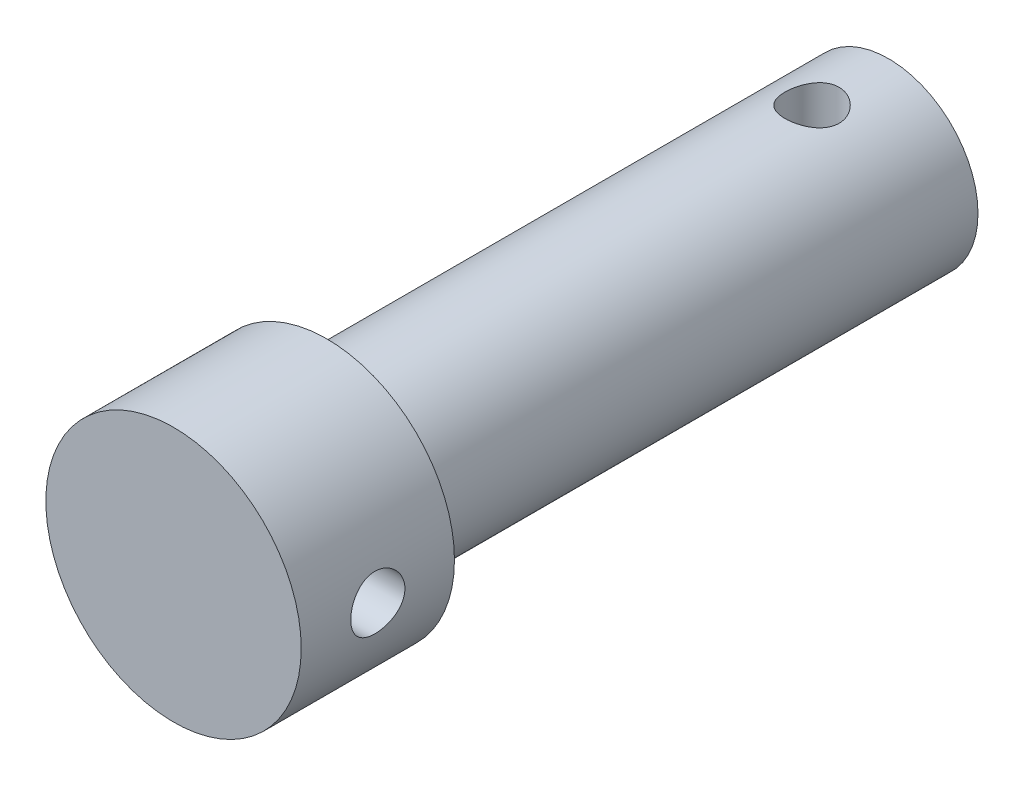
ISO-10303-21;
HEADER;
FILE_DESCRIPTION(('STEP AP214'),'2;1');
FILE_NAME('part.step','',(''),(''),'','','');
FILE_SCHEMA(('AUTOMOTIVE_DESIGN { 1 0 10303 214 1 1 1 1 }'));
ENDSEC;
DATA;
#1=APPLICATION_CONTEXT('core data for automotive mechanical design processes');
#2=APPLICATION_PROTOCOL_DEFINITION('international standard','automotive_design',2000,#1);
#3=PRODUCT_CONTEXT('',#1,'mechanical');
#4=PRODUCT('Part','Part','',(#3));
#5=PRODUCT_RELATED_PRODUCT_CATEGORY('part','',(#4));
#6=PRODUCT_DEFINITION_FORMATION('','',#4);
#7=PRODUCT_DEFINITION_CONTEXT('part definition',#1,'design');
#8=PRODUCT_DEFINITION('design','',#6,#7);
#9=PRODUCT_DEFINITION_SHAPE('','',#8);
#10=(LENGTH_UNIT() NAMED_UNIT(*) SI_UNIT(.MILLI.,.METRE.));
#11=(NAMED_UNIT(*) PLANE_ANGLE_UNIT() SI_UNIT($,.RADIAN.));
#12=(NAMED_UNIT(*) SI_UNIT($,.STERADIAN.) SOLID_ANGLE_UNIT());
#13=UNCERTAINTY_MEASURE_WITH_UNIT(LENGTH_MEASURE(1.E-05),#10,'distance_accuracy_value','');
#14=(GEOMETRIC_REPRESENTATION_CONTEXT(3) GLOBAL_UNCERTAINTY_ASSIGNED_CONTEXT((#13)) GLOBAL_UNIT_ASSIGNED_CONTEXT((#10,
#11,#12)) REPRESENTATION_CONTEXT('',''));
#15=CARTESIAN_POINT('',(0.,0.,0.));
#16=DIRECTION('',(0.,0.,1.));
#17=DIRECTION('',(1.,0.,0.));
#18=AXIS2_PLACEMENT_3D('',#15,#16,#17);
#19=CARTESIAN_POINT('',(0.,0.,88.9));
#20=DIRECTION('',(0.,0.,-1.));
#21=DIRECTION('',(-1.,0.,0.));
#22=AXIS2_PLACEMENT_3D('',#19,#20,#21);
#23=CYLINDRICAL_SURFACE('',#22,11.1125);
#24=CARTESIAN_POINT('',(0.,-11.1125,12.8905));
#25=CARTESIAN_POINT('',(0.18454648859931,-11.1124985539247,12.8904979867393));
#26=CARTESIAN_POINT('',(0.369113368042071,-11.1078590032233,12.8752703915655));
#27=CARTESIAN_POINT('',(0.732867234439549,-11.0898044723953,12.8149103110057));
#28=CARTESIAN_POINT('',(0.912052689594811,-11.076387017979,12.7697693936937));
#29=CARTESIAN_POINT('',(1.25974481405404,-11.0422458645744,12.6512318350351));
#30=CARTESIAN_POINT('',(1.42826697925694,-11.0215330688745,12.5778773454524));
#31=CARTESIAN_POINT('',(1.75061952455586,-10.9749508685287,12.4051692244398));
#32=CARTESIAN_POINT('',(1.90444786325311,-10.9490807489177,12.3058119876241));
#33=CARTESIAN_POINT('',(2.19753852317481,-10.8940955058189,12.0808622242893));
#34=CARTESIAN_POINT('',(2.33631125629758,-10.8649129244902,11.9546483410423));
#35=CARTESIAN_POINT('',(2.59107956545766,-10.8069915765864,11.6808920516006));
#36=CARTESIAN_POINT('',(2.70707121913324,-10.7782528872223,11.5333459800881));
#37=CARTESIAN_POINT('',(2.91557875736327,-10.7237572481128,11.2169494352114));
#38=CARTESIAN_POINT('',(3.00749390066177,-10.6980839973471,11.0476872952369));
#39=CARTESIAN_POINT('',(3.16135451771112,-10.6536357045236,10.6952052392852));
#40=CARTESIAN_POINT('',(3.22330734429379,-10.6348589703148,10.5119887605272));
#41=CARTESIAN_POINT('',(3.31371340949462,-10.6070332533145,10.1423026874618));
#42=CARTESIAN_POINT('',(3.34307051401413,-10.5977224402373,9.95607437270075));
#43=CARTESIAN_POINT('',(3.37027453755152,-10.5891042029735,9.58112089383516));
#44=CARTESIAN_POINT('',(3.36812925634142,-10.5897943026298,9.39239635933861));
#45=CARTESIAN_POINT('',(3.33309867594076,-10.6008680750188,9.02518623193327));
#46=CARTESIAN_POINT('',(3.30134948369066,-10.6108934687157,8.84657965773467));
#47=CARTESIAN_POINT('',(3.20984935703974,-10.6389280535616,8.49735743064407));
#48=CARTESIAN_POINT('',(3.15009561138092,-10.6569380462406,8.32674258189918));
#49=CARTESIAN_POINT('',(3.00345355774981,-10.6991959164762,7.99558439809866));
#50=CARTESIAN_POINT('',(2.91619943498689,-10.7235270635779,7.83521413173669));
#51=CARTESIAN_POINT('',(2.71728766090107,-10.7756461329288,7.53101278230698));
#52=CARTESIAN_POINT('',(2.60562399850085,-10.8034349059234,7.38718578651266));
#53=CARTESIAN_POINT('',(2.35543565388181,-10.86078762357,7.11371461278718));
#54=CARTESIAN_POINT('',(2.21596926023777,-10.8903767580284,6.984935748267));
#55=CARTESIAN_POINT('',(1.91705163238024,-10.946948245262,6.75239079091455));
#56=CARTESIAN_POINT('',(1.75759909281868,-10.9739304275662,6.64862633313457));
#57=CARTESIAN_POINT('',(1.42164140004213,-11.0225023677284,6.46851664564343));
#58=CARTESIAN_POINT('',(1.24502561969917,-11.0440534174476,6.39236662875208));
#59=CARTESIAN_POINT('',(0.880688905108863,-11.079055830549,6.27110859064646));
#60=CARTESIAN_POINT('',(0.692971146503918,-11.0925094979412,6.22599173880687));
#61=CARTESIAN_POINT('',(0.31911279039018,-11.1094354370752,6.16952886447727));
#62=CARTESIAN_POINT('',(0.13316468288138,-11.1132540833966,6.15701039056304));
#63=CARTESIAN_POINT('',(-0.238189129110412,-11.1114977683004,6.16280901242461));
#64=CARTESIAN_POINT('',(-0.423594904074904,-11.1059240872837,6.18112190514014));
#65=CARTESIAN_POINT('',(-0.784153946445704,-11.086236325331,6.24711690013771));
#66=CARTESIAN_POINT('',(-0.959445096878875,-11.0723224209258,6.29411107950512));
#67=CARTESIAN_POINT('',(-1.29961404345978,-11.0375685062395,6.41530434150366));
#68=CARTESIAN_POINT('',(-1.46449057661105,-11.016727657829,6.48950671631718));
#69=CARTESIAN_POINT('',(-1.78344174703357,-10.9696675819806,6.6649598417292));
#70=CARTESIAN_POINT('',(-1.93717288872194,-10.9433338047894,6.76680346861589));
#71=CARTESIAN_POINT('',(-2.22576094675935,-10.88830852699,6.99392976841081));
#72=CARTESIAN_POINT('',(-2.36061302823122,-10.8596164253961,7.1192184264034));
#73=CARTESIAN_POINT('',(-2.61279640305728,-10.8017742890589,7.39518842684334));
#74=CARTESIAN_POINT('',(-2.72929316780601,-10.7726466900822,7.5466387432046));
#75=CARTESIAN_POINT('',(-2.93528070176535,-10.7183567271987,7.86757195094808));
#76=CARTESIAN_POINT('',(-3.02477212204019,-10.6931942677045,8.03705440746525));
#77=CARTESIAN_POINT('',(-3.1736076974618,-10.6499712047652,8.38874104849284));
#78=CARTESIAN_POINT('',(-3.23308744804903,-10.6318787436454,8.57088370518612));
#79=CARTESIAN_POINT('',(-3.32034540533072,-10.6049558323281,8.94325208998982));
#80=CARTESIAN_POINT('',(-3.34813474175871,-10.596122130525,9.1334749559553));
#81=CARTESIAN_POINT('',(-3.37045662938603,-10.5890414559971,9.5079223405758));
#82=CARTESIAN_POINT('',(-3.36635149978056,-10.5903607895919,9.69205849494997));
#83=CARTESIAN_POINT('',(-3.32826114923991,-10.6023923699274,10.0568853366946));
#84=CARTESIAN_POINT('',(-3.2942771679669,-10.6131042269759,10.2375761666925));
#85=CARTESIAN_POINT('',(-3.19828069730974,-10.6424202010504,10.5881092015882));
#86=CARTESIAN_POINT('',(-3.13663547558501,-10.6609207127499,10.7580612945409));
#87=CARTESIAN_POINT('',(-2.98735299075596,-10.7037087078089,11.0853463502779));
#88=CARTESIAN_POINT('',(-2.89971068002799,-10.7279973148111,11.2426768548968));
#89=CARTESIAN_POINT('',(-2.69712141373994,-10.78074759807,11.546557767623));
#90=CARTESIAN_POINT('',(-2.58128331420839,-10.8093305242635,11.6924930060314));
#91=CARTESIAN_POINT('',(-2.32718657371388,-10.8668672130083,11.9632951312059));
#92=CARTESIAN_POINT('',(-2.18892207626199,-10.8958210706015,12.0881564972581));
#93=CARTESIAN_POINT('',(-1.88890390316094,-10.9518785453304,12.317002397626));
#94=CARTESIAN_POINT('',(-1.72657010833837,-10.9789006246686,12.4202484722963));
#95=CARTESIAN_POINT('',(-1.38602996608604,-11.0270609735101,12.5978401503018));
#96=CARTESIAN_POINT('',(-1.20783082422519,-11.0482018962467,12.6721987919773));
#97=CARTESIAN_POINT('',(-0.859409530823232,-11.0804557925693,12.7835222350417));
#98=CARTESIAN_POINT('',(-0.690229086354889,-11.0923719438608,12.823528658222));
#99=CARTESIAN_POINT('',(-0.347371255159506,-11.1083940460523,12.8770161717421));
#100=CARTESIAN_POINT('',(-0.173694659218377,-11.1125013610422,12.8905018948755));
#101=CARTESIAN_POINT('',(0.,-11.1125,12.8905));
#102=B_SPLINE_CURVE_WITH_KNOTS('',3,(#24,#25,#26,#27,#28,#29,#30,#31,#32,#33,#34,#35,#36,#37,
#38,#39,#40,#41,#42,#43,#44,#45,#46,#47,#48,#49,#50,#51,#52,#53,#54,#55,#56,#57,#58,#59,#60,#61,
#62,#63,#64,#65,#66,#67,#68,#69,#70,#71,#72,#73,#74,#75,#76,#77,#78,#79,#80,#81,#82,#83,#84,#85,
#86,#87,#88,#89,#90,#91,#92,#93,#94,#95,#96,#97,#98,#99,#100,#101),.UNSPECIFIED.,.T.,.F.,(4,2,2,
2,2,2,2,2,2,2,2,2,2,2,2,2,2,2,2,2,2,2,2,2,2,2,2,2,2,2,2,2,2,2,2,2,2,2,4),(0.,0.553001350217601,
1.10615864603718,1.65849270160667,2.21090338113221,2.77784490732625,3.34488396200037,
3.92495387261643,4.50488136021917,5.06829157996299,5.63156230560003,6.17406877273799,
6.71662971146135,7.2667362812624,7.81697847286606,8.39066335224184,8.96438572003807,
9.54208824412222,10.1196263122981,10.676085698619,11.2324692322216,11.7760054210621,
12.3196073993108,12.8759429126142,13.4324206423496,14.0095213653506,14.5866081740813,
15.1610637668035,15.7353175474398,16.2851822648756,16.8350241697101,17.3777722650046,
17.9206258099266,18.4835872190824,19.0466958788671,19.6266934207033,20.2064288757124,
20.7270032057983,21.2474865907837),.UNSPECIFIED.);
#103=CARTESIAN_POINT('',(0.,-11.1125,12.8905));
#104=VERTEX_POINT('',#103);
#105=EDGE_CURVE('E97',#104,#104,#102,.T.);
#106=ORIENTED_EDGE('',*,*,#105,.T.);
#107=EDGE_LOOP('',(#106));
#108=FACE_BOUND('',#107,.T.);
#109=CARTESIAN_POINT('',(0.,11.1125,12.8905));
#110=CARTESIAN_POINT('',(-0.18454648859931,11.1124985539247,12.8904979867393));
#111=CARTESIAN_POINT('',(-0.369113368042071,11.1078590032233,12.8752703915655));
#112=CARTESIAN_POINT('',(-0.732867234439549,11.0898044723953,12.8149103110057));
#113=CARTESIAN_POINT('',(-0.912052689594811,11.076387017979,12.7697693936937));
#114=CARTESIAN_POINT('',(-1.25974481405404,11.0422458645744,12.6512318350351));
#115=CARTESIAN_POINT('',(-1.42826697925694,11.0215330688745,12.5778773454524));
#116=CARTESIAN_POINT('',(-1.75061952455586,10.9749508685287,12.4051692244398));
#117=CARTESIAN_POINT('',(-1.90444786325311,10.9490807489177,12.3058119876241));
#118=CARTESIAN_POINT('',(-2.19753852317481,10.8940955058189,12.0808622242893));
#119=CARTESIAN_POINT('',(-2.33631125629758,10.8649129244902,11.9546483410423));
#120=CARTESIAN_POINT('',(-2.59107956545766,10.8069915765864,11.6808920516006));
#121=CARTESIAN_POINT('',(-2.70707121913324,10.7782528872223,11.5333459800881));
#122=CARTESIAN_POINT('',(-2.91557875736327,10.7237572481128,11.2169494352114));
#123=CARTESIAN_POINT('',(-3.00749390066177,10.6980839973471,11.0476872952369));
#124=CARTESIAN_POINT('',(-3.16135451771112,10.6536357045236,10.6952052392852));
#125=CARTESIAN_POINT('',(-3.22330734429379,10.6348589703148,10.5119887605272));
#126=CARTESIAN_POINT('',(-3.31371340949462,10.6070332533145,10.1423026874618));
#127=CARTESIAN_POINT('',(-3.34307051401413,10.5977224402373,9.95607437270075));
#128=CARTESIAN_POINT('',(-3.37027453755152,10.5891042029735,9.58112089383516));
#129=CARTESIAN_POINT('',(-3.36812925634142,10.5897943026298,9.39239635933861));
#130=CARTESIAN_POINT('',(-3.33309867594076,10.6008680750188,9.02518623193327));
#131=CARTESIAN_POINT('',(-3.30134948369066,10.6108934687157,8.84657965773467));
#132=CARTESIAN_POINT('',(-3.20984935703974,10.6389280535616,8.49735743064407));
#133=CARTESIAN_POINT('',(-3.15009561138092,10.6569380462406,8.32674258189918));
#134=CARTESIAN_POINT('',(-3.00345355774981,10.6991959164762,7.99558439809866));
#135=CARTESIAN_POINT('',(-2.91619943498689,10.7235270635779,7.83521413173669));
#136=CARTESIAN_POINT('',(-2.71728766090107,10.7756461329288,7.53101278230698));
#137=CARTESIAN_POINT('',(-2.60562399850085,10.8034349059234,7.38718578651266));
#138=CARTESIAN_POINT('',(-2.35543565388181,10.86078762357,7.11371461278718));
#139=CARTESIAN_POINT('',(-2.21596926023777,10.8903767580284,6.984935748267));
#140=CARTESIAN_POINT('',(-1.91705163238024,10.946948245262,6.75239079091455));
#141=CARTESIAN_POINT('',(-1.75759909281868,10.9739304275662,6.64862633313457));
#142=CARTESIAN_POINT('',(-1.42164140004213,11.0225023677284,6.46851664564343));
#143=CARTESIAN_POINT('',(-1.24502561969917,11.0440534174476,6.39236662875208));
#144=CARTESIAN_POINT('',(-0.880688905108863,11.079055830549,6.27110859064646));
#145=CARTESIAN_POINT('',(-0.692971146503918,11.0925094979412,6.22599173880687));
#146=CARTESIAN_POINT('',(-0.31911279039018,11.1094354370752,6.16952886447727));
#147=CARTESIAN_POINT('',(-0.13316468288138,11.1132540833966,6.15701039056304));
#148=CARTESIAN_POINT('',(0.238189129110412,11.1114977683004,6.16280901242461));
#149=CARTESIAN_POINT('',(0.423594904074904,11.1059240872837,6.18112190514014));
#150=CARTESIAN_POINT('',(0.784153946445704,11.086236325331,6.24711690013771));
#151=CARTESIAN_POINT('',(0.959445096878875,11.0723224209258,6.29411107950512));
#152=CARTESIAN_POINT('',(1.29961404345978,11.0375685062395,6.41530434150366));
#153=CARTESIAN_POINT('',(1.46449057661105,11.016727657829,6.48950671631718));
#154=CARTESIAN_POINT('',(1.78344174703357,10.9696675819806,6.6649598417292));
#155=CARTESIAN_POINT('',(1.93717288872194,10.9433338047894,6.76680346861589));
#156=CARTESIAN_POINT('',(2.22576094675935,10.88830852699,6.99392976841081));
#157=CARTESIAN_POINT('',(2.36061302823122,10.8596164253961,7.1192184264034));
#158=CARTESIAN_POINT('',(2.61279640305728,10.8017742890589,7.39518842684334));
#159=CARTESIAN_POINT('',(2.72929316780601,10.7726466900822,7.5466387432046));
#160=CARTESIAN_POINT('',(2.93528070176535,10.7183567271987,7.86757195094808));
#161=CARTESIAN_POINT('',(3.02477212204019,10.6931942677045,8.03705440746525));
#162=CARTESIAN_POINT('',(3.1736076974618,10.6499712047652,8.38874104849284));
#163=CARTESIAN_POINT('',(3.23308744804903,10.6318787436454,8.57088370518612));
#164=CARTESIAN_POINT('',(3.32034540533072,10.6049558323281,8.94325208998982));
#165=CARTESIAN_POINT('',(3.34813474175871,10.596122130525,9.1334749559553));
#166=CARTESIAN_POINT('',(3.37045662938603,10.5890414559971,9.5079223405758));
#167=CARTESIAN_POINT('',(3.36635149978056,10.5903607895919,9.69205849494997));
#168=CARTESIAN_POINT('',(3.32826114923991,10.6023923699274,10.0568853366946));
#169=CARTESIAN_POINT('',(3.2942771679669,10.6131042269759,10.2375761666925));
#170=CARTESIAN_POINT('',(3.19828069730974,10.6424202010504,10.5881092015882));
#171=CARTESIAN_POINT('',(3.13663547558501,10.6609207127499,10.7580612945409));
#172=CARTESIAN_POINT('',(2.98735299075596,10.7037087078089,11.0853463502779));
#173=CARTESIAN_POINT('',(2.89971068002799,10.7279973148111,11.2426768548968));
#174=CARTESIAN_POINT('',(2.69712141373994,10.78074759807,11.546557767623));
#175=CARTESIAN_POINT('',(2.58128331420839,10.8093305242635,11.6924930060314));
#176=CARTESIAN_POINT('',(2.32718657371388,10.8668672130083,11.9632951312059));
#177=CARTESIAN_POINT('',(2.18892207626199,10.8958210706015,12.0881564972581));
#178=CARTESIAN_POINT('',(1.88890390316094,10.9518785453304,12.317002397626));
#179=CARTESIAN_POINT('',(1.72657010833837,10.9789006246686,12.4202484722963));
#180=CARTESIAN_POINT('',(1.38602996608604,11.0270609735101,12.5978401503018));
#181=CARTESIAN_POINT('',(1.20783082422519,11.0482018962467,12.6721987919773));
#182=CARTESIAN_POINT('',(0.859409530823232,11.0804557925693,12.7835222350417));
#183=CARTESIAN_POINT('',(0.690229086354889,11.0923719438608,12.823528658222));
#184=CARTESIAN_POINT('',(0.347371255159506,11.1083940460523,12.8770161717421));
#185=CARTESIAN_POINT('',(0.173694659218377,11.1125013610422,12.8905018948755));
#186=CARTESIAN_POINT('',(0.,11.1125,12.8905));
#187=B_SPLINE_CURVE_WITH_KNOTS('',3,(#109,#110,#111,#112,#113,#114,#115,#116,#117,#118,#119,
#120,#121,#122,#123,#124,#125,#126,#127,#128,#129,#130,#131,#132,#133,#134,#135,#136,#137,#138,
#139,#140,#141,#142,#143,#144,#145,#146,#147,#148,#149,#150,#151,#152,#153,#154,#155,#156,#157,
#158,#159,#160,#161,#162,#163,#164,#165,#166,#167,#168,#169,#170,#171,#172,#173,#174,#175,#176,
#177,#178,#179,#180,#181,#182,#183,#184,#185,#186),.UNSPECIFIED.,.T.,.F.,(4,2,2,2,2,2,2,2,2,2,2,
2,2,2,2,2,2,2,2,2,2,2,2,2,2,2,2,2,2,2,2,2,2,2,2,2,2,2,4),(0.,0.553001350217601,1.10615864603718,
1.65849270160667,2.21090338113221,2.77784490732625,3.34488396200037,3.92495387261643,
4.50488136021917,5.06829157996299,5.63156230560003,6.17406877273799,6.71662971146135,
7.2667362812624,7.81697847286606,8.39066335224184,8.96438572003807,9.54208824412222,
10.1196263122981,10.676085698619,11.2324692322216,11.7760054210621,12.3196073993108,
12.8759429126142,13.4324206423496,14.0095213653506,14.5866081740813,15.1610637668035,
15.7353175474398,16.2851822648756,16.8350241697101,17.3777722650046,17.9206258099266,
18.4835872190824,19.0466958788671,19.6266934207033,20.2064288757124,20.7270032057983,
21.2474865907837),.UNSPECIFIED.);
#188=CARTESIAN_POINT('',(0.,11.1125,12.8905));
#189=VERTEX_POINT('',#188);
#190=EDGE_CURVE('E101',#189,#189,#187,.T.);
#191=ORIENTED_EDGE('',*,*,#190,.T.);
#192=EDGE_LOOP('',(#191));
#193=FACE_BOUND('',#192,.T.);
#194=CARTESIAN_POINT('',(0.,0.,0.));
#195=DIRECTION('',(0.,0.,1.));
#196=DIRECTION('',(1.,0.,0.));
#197=AXIS2_PLACEMENT_3D('',#194,#195,#196);
#198=CIRCLE('',#197,11.1125);
#199=CARTESIAN_POINT('',(11.1125,0.,0.));
#200=VERTEX_POINT('',#199);
#201=EDGE_CURVE('E105',#200,#200,#198,.T.);
#202=ORIENTED_EDGE('',*,*,#201,.T.);
#203=EDGE_LOOP('',(#202));
#204=FACE_BOUND('',#203,.T.);
#205=CARTESIAN_POINT('',(0.,0.,69.85));
#206=DIRECTION('',(0.,0.,1.));
#207=DIRECTION('',(1.,0.,0.));
#208=AXIS2_PLACEMENT_3D('',#205,#206,#207);
#209=CIRCLE('',#208,11.1125);
#210=CARTESIAN_POINT('',(11.1125,0.,69.85));
#211=VERTEX_POINT('',#210);
#212=EDGE_CURVE('E48',#211,#211,#209,.T.);
#213=ORIENTED_EDGE('',*,*,#212,.F.);
#214=EDGE_LOOP('',(#213));
#215=FACE_BOUND('',#214,.T.);
#216=ADVANCED_FACE('F31',(#108,#193,#204,#215),#23,.T.);
#217=CARTESIAN_POINT('',(0.,0.,88.9));
#218=DIRECTION('',(0.,0.,-1.));
#219=DIRECTION('',(-1.,0.,0.));
#220=AXIS2_PLACEMENT_3D('',#217,#218,#219);
#221=CYLINDRICAL_SURFACE('',#220,5.08);
#222=CARTESIAN_POINT('',(0.,-5.08,12.8905));
#223=CARTESIAN_POINT('',(0.169285515100474,-5.07999607220677,12.890495472719));
#224=CARTESIAN_POINT('',(0.338597322625488,-5.07146252230316,12.8776546212046));
#225=CARTESIAN_POINT('',(0.671828491229241,-5.03816851640603,12.8270730760624));
#226=CARTESIAN_POINT('',(0.835744771264298,-5.0133989522646,12.7893184060956));
#227=CARTESIAN_POINT('',(1.15287823963801,-4.95008331129225,12.6912134453194));
#228=CARTESIAN_POINT('',(1.30614166985143,-4.91160188484077,12.6309691289881));
#229=CARTESIAN_POINT('',(1.599776464673,-4.82396383088007,12.4904393405647));
#230=CARTESIAN_POINT('',(1.74014606404384,-4.77480574476696,12.4101511299291));
#231=CARTESIAN_POINT('',(2.01738158675677,-4.66483042903902,12.2244287038195));
#232=CARTESIAN_POINT('',(2.15295221637973,-4.60337937797944,12.1174442236705));
#233=CARTESIAN_POINT('',(2.40545569954511,-4.47662708729593,11.8850580110218));
#234=CARTESIAN_POINT('',(2.52236155609137,-4.41132045448041,11.7596300961343));
#235=CARTESIAN_POINT('',(2.75279725771018,-4.27191990255766,11.4712527799588));
#236=CARTESIAN_POINT('',(2.86297592669422,-4.19803851524835,11.3055016432098));
#237=CARTESIAN_POINT('',(3.05375878844182,-4.06137128403161,10.9536433836713));
#238=CARTESIAN_POINT('',(3.13441414241739,-3.99856634449236,10.7675722073679));
#239=CARTESIAN_POINT('',(3.24371437699699,-3.91001117540028,10.4340020146419));
#240=CARTESIAN_POINT('',(3.28063587745091,-3.87880070296635,10.290678685406));
#241=CARTESIAN_POINT('',(3.33539605205291,-3.83182322679226,9.99806372071025));
#242=CARTESIAN_POINT('',(3.35326699681346,-3.8160301107193,9.84878262395695));
#243=CARTESIAN_POINT('',(3.36880808310953,-3.80232317525715,9.54772546816266));
#244=CARTESIAN_POINT('',(3.36639909897108,-3.80447938793424,9.39594194470956));
#245=CARTESIAN_POINT('',(3.34136913571208,-3.82647371511538,9.09530375538999));
#246=CARTESIAN_POINT('',(3.31873105936243,-3.84632678662001,8.94645167590875));
#247=CARTESIAN_POINT('',(3.25605881841265,-3.89949433304544,8.66183616922189));
#248=CARTESIAN_POINT('',(3.21678954214402,-3.93221286178468,8.52578577889504));
#249=CARTESIAN_POINT('',(3.12269747957724,-4.00734029285767,8.2620768875535));
#250=CARTESIAN_POINT('',(3.06786958534926,-4.04975237671647,8.13442115950686));
#251=CARTESIAN_POINT('',(2.93154190043105,-4.14981433789706,7.86366142732808));
#252=CARTESIAN_POINT('',(2.84689157031767,-4.20881166106679,7.72264584548786));
#253=CARTESIAN_POINT('',(2.65880033673884,-4.33009674057705,7.45518193470924));
#254=CARTESIAN_POINT('',(2.55533634904303,-4.39238847180014,7.3287518170141));
#255=CARTESIAN_POINT('',(2.30715108354324,-4.52851581297706,7.06681454231553));
#256=CARTESIAN_POINT('',(2.15832876131921,-4.60202708422382,6.93498125536046));
#257=CARTESIAN_POINT('',(1.83691578758838,-4.73947285624612,6.69797322145117));
#258=CARTESIAN_POINT('',(1.66434822398038,-4.80341653519893,6.59277285764151));
#259=CARTESIAN_POINT('',(1.33482776049555,-4.90389738471845,6.43120789345191));
#260=CARTESIAN_POINT('',(1.18148242772024,-4.94335147134003,6.36930728380993));
#261=CARTESIAN_POINT('',(0.86470362000778,-5.00846860198705,6.26824515296873));
#262=CARTESIAN_POINT('',(0.701278748329896,-5.03414323053291,6.22906452862644));
#263=CARTESIAN_POINT('',(0.367966428868476,-5.06943608887609,6.17540493519758));
#264=CARTESIAN_POINT('',(0.198055070627116,-5.07898754382304,6.16102868915638));
#265=CARTESIAN_POINT('',(-0.142086425775923,-5.08085829714309,6.15820400600323));
#266=CARTESIAN_POINT('',(-0.312316548738281,-5.07317839723692,6.16975436260804));
#267=CARTESIAN_POINT('',(-0.636169551782714,-5.0424578004744,6.21639839332323));
#268=CARTESIAN_POINT('',(-0.790138080107922,-5.02048825267494,6.24985133310806));
#269=CARTESIAN_POINT('',(-1.08978003461095,-4.96407522746765,6.33700168667246));
#270=CARTESIAN_POINT('',(-1.23545212751528,-4.92962975163277,6.39070234384133));
#271=CARTESIAN_POINT('',(-1.52461890801589,-4.84828890822987,6.52020454093544));
#272=CARTESIAN_POINT('',(-1.66739895347338,-4.80074619090939,6.59718477039365));
#273=CARTESIAN_POINT('',(-1.93852917500824,-4.69782645865814,6.76918581020457));
#274=CARTESIAN_POINT('',(-2.06686997312613,-4.64244440437754,6.86421823857103));
#275=CARTESIAN_POINT('',(-2.32684198308059,-4.51841428827544,7.08653817307723));
#276=CARTESIAN_POINT('',(-2.45580461695176,-4.44905100774229,7.21654865270323));
#277=CARTESIAN_POINT('',(-2.6912340180669,-4.31072029601516,7.49589969724497));
#278=CARTESIAN_POINT('',(-2.7976867922375,-4.24175313682728,7.64525219350636));
#279=CARTESIAN_POINT('',(-2.97721549439986,-4.11744650945246,7.9468344018922));
#280=CARTESIAN_POINT('',(-3.05248907488511,-4.06143539050208,8.09747201659804));
#281=CARTESIAN_POINT('',(-3.18058073665498,-3.96193301644552,8.41181900720757));
#282=CARTESIAN_POINT('',(-3.23343933698653,-3.91841921658957,8.57550415531666));
#283=CARTESIAN_POINT('',(-3.30696482296675,-3.85646250656066,8.88378154428143));
#284=CARTESIAN_POINT('',(-3.33161039392893,-3.83499076509881,9.02680070093057));
#285=CARTESIAN_POINT('',(-3.3621640935631,-3.80824042655883,9.31627341454828));
#286=CARTESIAN_POINT('',(-3.3680910799087,-3.80294553260623,9.46272336524639));
#287=CARTESIAN_POINT('',(-3.36082426225541,-3.80936675169973,9.75478580715344));
#288=CARTESIAN_POINT('',(-3.34762587110737,-3.82108694575131,9.90039808904017));
#289=CARTESIAN_POINT('',(-3.3029843450792,-3.8597322594931,10.1867831395042));
#290=CARTESIAN_POINT('',(-3.2715170182228,-3.88667753918327,10.3275492283594));
#291=CARTESIAN_POINT('',(-3.18102379496339,-3.96128414463431,10.6388555547474));
#292=CARTESIAN_POINT('',(-3.11681159637244,-4.01259739318832,10.8069963240744));
#293=CARTESIAN_POINT('',(-2.96456382278645,-4.12635050751353,11.1280052840646));
#294=CARTESIAN_POINT('',(-2.8764950189384,-4.18880585089551,11.2808517622422));
#295=CARTESIAN_POINT('',(-2.67705666388318,-4.31905338318601,11.5723618955804));
#296=CARTESIAN_POINT('',(-2.5653047691132,-4.38692008145587,11.7107290417821));
#297=CARTESIAN_POINT('',(-2.32085593454986,-4.52099962869806,11.9687195816275));
#298=CARTESIAN_POINT('',(-2.18815281153042,-4.58721198272969,12.0883374210528));
#299=CARTESIAN_POINT('',(-1.96514904716679,-4.68533754850621,12.2590643608163));
#300=CARTESIAN_POINT('',(-1.88136809678885,-4.71968833117717,12.3174109145614));
#301=CARTESIAN_POINT('',(-1.70795596173606,-4.78517110041401,12.4267188529764));
#302=CARTESIAN_POINT('',(-1.61832756277298,-4.81630460168131,12.4776837175384));
#303=CARTESIAN_POINT('',(-1.43378498213807,-4.87442339142426,12.5715637385191));
#304=CARTESIAN_POINT('',(-1.33887672503369,-4.90141320656908,12.6144876904916));
#305=CARTESIAN_POINT('',(-1.14442436122478,-4.95043005776858,12.6916754074162));
#306=CARTESIAN_POINT('',(-1.04488206433252,-4.97245901197595,12.7259425202241));
#307=CARTESIAN_POINT('',(-0.792031094564267,-5.02023170353846,12.7997634490334));
#308=CARTESIAN_POINT('',(-0.636329925742265,-5.04248495604223,12.8336460593834));
#309=CARTESIAN_POINT('',(-0.320425144514222,-5.07236648748686,12.8790096219057));
#310=CARTESIAN_POINT('',(-0.16022434880689,-5.08000371755441,12.890504284954));
#311=CARTESIAN_POINT('',(0.,-5.08,12.8905));
#312=B_SPLINE_CURVE_WITH_KNOTS('',3,(#222,#223,#224,#225,#226,#227,#228,#229,#230,#231,#232,
#233,#234,#235,#236,#237,#238,#239,#240,#241,#242,#243,#244,#245,#246,#247,#248,#249,#250,#251,
#252,#253,#254,#255,#256,#257,#258,#259,#260,#261,#262,#263,#264,#265,#266,#267,#268,#269,#270,
#271,#272,#273,#274,#275,#276,#277,#278,#279,#280,#281,#282,#283,#284,#285,#286,#287,#288,#289,
#290,#291,#292,#293,#294,#295,#296,#297,#298,#299,#300,#301,#302,#303,#304,#305,#306,#307,#308,
#309,#310,#311),.UNSPECIFIED.,.T.,.F.,(4,2,2,2,2,2,2,2,2,2,2,2,2,2,2,2,2,2,2,2,2,2,2,2,2,2,2,2,
2,2,2,2,2,2,2,2,2,2,2,2,2,2,2,2,4),(0.,0.507228431962578,1.01474165488103,1.51989298417278,
2.02511336874148,2.57296841428526,3.12160884335346,3.75555448379733,4.38839629437364,
4.84036247131243,5.29156181940231,5.74452241379731,6.197866204012,6.63230305858631,
7.06688270510888,7.58924876031513,8.11226013390957,8.74515710525969,9.37744299232171,
9.8853318943765,10.3927931379122,10.9023509448238,11.4118850441055,11.8870472281705,
12.362285558653,12.867447537211,13.3729357356284,13.9580813820638,14.5435897171122,
15.074023198619,15.6034936974399,16.0416878671193,16.4794404455642,16.9172980346822,
17.3557367676481,17.9142098081426,18.473464757708,19.0425496004673,19.611802709286,
19.9345724427824,20.257189516716,20.5794516085399,20.9015888806347,21.3819617176819,
21.8620402711205),.UNSPECIFIED.);
#313=CARTESIAN_POINT('',(0.,-5.08,12.8905));
#314=VERTEX_POINT('',#313);
#315=EDGE_CURVE('E35',#314,#314,#312,.T.);
#316=ORIENTED_EDGE('',*,*,#315,.F.);
#317=EDGE_LOOP('',(#316));
#318=FACE_BOUND('',#317,.T.);
#319=CARTESIAN_POINT('',(0.,5.08,12.8905));
#320=CARTESIAN_POINT('',(-0.169285515100474,5.07999607220677,12.890495472719));
#321=CARTESIAN_POINT('',(-0.338597322625488,5.07146252230316,12.8776546212046));
#322=CARTESIAN_POINT('',(-0.671828491229241,5.03816851640603,12.8270730760624));
#323=CARTESIAN_POINT('',(-0.835744771264298,5.0133989522646,12.7893184060956));
#324=CARTESIAN_POINT('',(-1.15287823963801,4.95008331129225,12.6912134453194));
#325=CARTESIAN_POINT('',(-1.30614166985143,4.91160188484077,12.6309691289881));
#326=CARTESIAN_POINT('',(-1.599776464673,4.82396383088007,12.4904393405647));
#327=CARTESIAN_POINT('',(-1.74014606404384,4.77480574476696,12.4101511299291));
#328=CARTESIAN_POINT('',(-2.01738158675677,4.66483042903902,12.2244287038195));
#329=CARTESIAN_POINT('',(-2.15295221637973,4.60337937797944,12.1174442236705));
#330=CARTESIAN_POINT('',(-2.40545569954511,4.47662708729593,11.8850580110218));
#331=CARTESIAN_POINT('',(-2.52236155609137,4.41132045448041,11.7596300961343));
#332=CARTESIAN_POINT('',(-2.75279725771018,4.27191990255766,11.4712527799588));
#333=CARTESIAN_POINT('',(-2.86297592669422,4.19803851524835,11.3055016432098));
#334=CARTESIAN_POINT('',(-3.05375878844182,4.06137128403161,10.9536433836713));
#335=CARTESIAN_POINT('',(-3.13441414241739,3.99856634449236,10.7675722073679));
#336=CARTESIAN_POINT('',(-3.24371437699699,3.91001117540028,10.4340020146419));
#337=CARTESIAN_POINT('',(-3.28063587745091,3.87880070296635,10.290678685406));
#338=CARTESIAN_POINT('',(-3.33539605205291,3.83182322679226,9.99806372071025));
#339=CARTESIAN_POINT('',(-3.35326699681346,3.8160301107193,9.84878262395695));
#340=CARTESIAN_POINT('',(-3.36880808310953,3.80232317525715,9.54772546816266));
#341=CARTESIAN_POINT('',(-3.36639909897108,3.80447938793424,9.39594194470956));
#342=CARTESIAN_POINT('',(-3.34136913571208,3.82647371511538,9.09530375538999));
#343=CARTESIAN_POINT('',(-3.31873105936243,3.84632678662001,8.94645167590875));
#344=CARTESIAN_POINT('',(-3.25605881841265,3.89949433304544,8.66183616922189));
#345=CARTESIAN_POINT('',(-3.21678954214402,3.93221286178468,8.52578577889504));
#346=CARTESIAN_POINT('',(-3.12269747957724,4.00734029285767,8.2620768875535));
#347=CARTESIAN_POINT('',(-3.06786958534926,4.04975237671647,8.13442115950686));
#348=CARTESIAN_POINT('',(-2.93154190043105,4.14981433789706,7.86366142732808));
#349=CARTESIAN_POINT('',(-2.84689157031767,4.20881166106679,7.72264584548786));
#350=CARTESIAN_POINT('',(-2.65880033673884,4.33009674057705,7.45518193470924));
#351=CARTESIAN_POINT('',(-2.55533634904303,4.39238847180014,7.3287518170141));
#352=CARTESIAN_POINT('',(-2.30715108354324,4.52851581297706,7.06681454231553));
#353=CARTESIAN_POINT('',(-2.15832876131921,4.60202708422382,6.93498125536046));
#354=CARTESIAN_POINT('',(-1.83691578758838,4.73947285624612,6.69797322145117));
#355=CARTESIAN_POINT('',(-1.66434822398038,4.80341653519893,6.59277285764151));
#356=CARTESIAN_POINT('',(-1.33482776049555,4.90389738471845,6.43120789345191));
#357=CARTESIAN_POINT('',(-1.18148242772024,4.94335147134003,6.36930728380993));
#358=CARTESIAN_POINT('',(-0.86470362000778,5.00846860198705,6.26824515296873));
#359=CARTESIAN_POINT('',(-0.701278748329896,5.03414323053291,6.22906452862644));
#360=CARTESIAN_POINT('',(-0.367966428868476,5.06943608887609,6.17540493519758));
#361=CARTESIAN_POINT('',(-0.198055070627116,5.07898754382304,6.16102868915638));
#362=CARTESIAN_POINT('',(0.142086425775923,5.08085829714309,6.15820400600323));
#363=CARTESIAN_POINT('',(0.312316548738281,5.07317839723692,6.16975436260804));
#364=CARTESIAN_POINT('',(0.636169551782714,5.0424578004744,6.21639839332323));
#365=CARTESIAN_POINT('',(0.790138080107922,5.02048825267494,6.24985133310806));
#366=CARTESIAN_POINT('',(1.08978003461095,4.96407522746765,6.33700168667246));
#367=CARTESIAN_POINT('',(1.23545212751528,4.92962975163277,6.39070234384133));
#368=CARTESIAN_POINT('',(1.52461890801589,4.84828890822987,6.52020454093544));
#369=CARTESIAN_POINT('',(1.66739895347338,4.80074619090939,6.59718477039365));
#370=CARTESIAN_POINT('',(1.93852917500824,4.69782645865814,6.76918581020457));
#371=CARTESIAN_POINT('',(2.06686997312613,4.64244440437754,6.86421823857103));
#372=CARTESIAN_POINT('',(2.32684198308059,4.51841428827544,7.08653817307723));
#373=CARTESIAN_POINT('',(2.45580461695176,4.44905100774229,7.21654865270323));
#374=CARTESIAN_POINT('',(2.6912340180669,4.31072029601516,7.49589969724497));
#375=CARTESIAN_POINT('',(2.7976867922375,4.24175313682728,7.64525219350636));
#376=CARTESIAN_POINT('',(2.97721549439986,4.11744650945246,7.9468344018922));
#377=CARTESIAN_POINT('',(3.05248907488511,4.06143539050208,8.09747201659804));
#378=CARTESIAN_POINT('',(3.18058073665498,3.96193301644552,8.41181900720757));
#379=CARTESIAN_POINT('',(3.23343933698653,3.91841921658957,8.57550415531666));
#380=CARTESIAN_POINT('',(3.30696482296675,3.85646250656066,8.88378154428143));
#381=CARTESIAN_POINT('',(3.33161039392893,3.83499076509881,9.02680070093057));
#382=CARTESIAN_POINT('',(3.3621640935631,3.80824042655883,9.31627341454828));
#383=CARTESIAN_POINT('',(3.3680910799087,3.80294553260623,9.46272336524639));
#384=CARTESIAN_POINT('',(3.36082426225541,3.80936675169973,9.75478580715344));
#385=CARTESIAN_POINT('',(3.34762587110737,3.82108694575131,9.90039808904017));
#386=CARTESIAN_POINT('',(3.3029843450792,3.8597322594931,10.1867831395042));
#387=CARTESIAN_POINT('',(3.2715170182228,3.88667753918327,10.3275492283594));
#388=CARTESIAN_POINT('',(3.18102379496339,3.96128414463431,10.6388555547474));
#389=CARTESIAN_POINT('',(3.11681159637244,4.01259739318832,10.8069963240744));
#390=CARTESIAN_POINT('',(2.96456382278645,4.12635050751353,11.1280052840646));
#391=CARTESIAN_POINT('',(2.8764950189384,4.18880585089551,11.2808517622422));
#392=CARTESIAN_POINT('',(2.67705666388318,4.31905338318601,11.5723618955804));
#393=CARTESIAN_POINT('',(2.5653047691132,4.38692008145587,11.7107290417821));
#394=CARTESIAN_POINT('',(2.32085593454986,4.52099962869806,11.9687195816275));
#395=CARTESIAN_POINT('',(2.18815281153042,4.58721198272969,12.0883374210528));
#396=CARTESIAN_POINT('',(1.96514904716679,4.68533754850621,12.2590643608163));
#397=CARTESIAN_POINT('',(1.88136809678885,4.71968833117717,12.3174109145614));
#398=CARTESIAN_POINT('',(1.70795596173606,4.78517110041401,12.4267188529764));
#399=CARTESIAN_POINT('',(1.61832756277298,4.81630460168131,12.4776837175384));
#400=CARTESIAN_POINT('',(1.43378498213807,4.87442339142426,12.5715637385191));
#401=CARTESIAN_POINT('',(1.33887672503369,4.90141320656908,12.6144876904916));
#402=CARTESIAN_POINT('',(1.14442436122478,4.95043005776858,12.6916754074162));
#403=CARTESIAN_POINT('',(1.04488206433252,4.97245901197595,12.7259425202241));
#404=CARTESIAN_POINT('',(0.792031094564267,5.02023170353846,12.7997634490334));
#405=CARTESIAN_POINT('',(0.636329925742265,5.04248495604223,12.8336460593834));
#406=CARTESIAN_POINT('',(0.320425144514222,5.07236648748686,12.8790096219057));
#407=CARTESIAN_POINT('',(0.16022434880689,5.08000371755441,12.890504284954));
#408=CARTESIAN_POINT('',(0.,5.08,12.8905));
#409=B_SPLINE_CURVE_WITH_KNOTS('',3,(#319,#320,#321,#322,#323,#324,#325,#326,#327,#328,#329,
#330,#331,#332,#333,#334,#335,#336,#337,#338,#339,#340,#341,#342,#343,#344,#345,#346,#347,#348,
#349,#350,#351,#352,#353,#354,#355,#356,#357,#358,#359,#360,#361,#362,#363,#364,#365,#366,#367,
#368,#369,#370,#371,#372,#373,#374,#375,#376,#377,#378,#379,#380,#381,#382,#383,#384,#385,#386,
#387,#388,#389,#390,#391,#392,#393,#394,#395,#396,#397,#398,#399,#400,#401,#402,#403,#404,#405,
#406,#407,#408),.UNSPECIFIED.,.T.,.F.,(4,2,2,2,2,2,2,2,2,2,2,2,2,2,2,2,2,2,2,2,2,2,2,2,2,2,2,2,
2,2,2,2,2,2,2,2,2,2,2,2,2,2,2,2,4),(0.,0.507228431962578,1.01474165488103,1.51989298417278,
2.02511336874148,2.57296841428526,3.12160884335346,3.75555448379733,4.38839629437364,
4.84036247131243,5.29156181940231,5.74452241379731,6.197866204012,6.63230305858631,
7.06688270510888,7.58924876031513,8.11226013390957,8.74515710525969,9.37744299232171,
9.8853318943765,10.3927931379122,10.9023509448238,11.4118850441055,11.8870472281705,
12.362285558653,12.867447537211,13.3729357356284,13.9580813820638,14.5435897171122,
15.074023198619,15.6034936974399,16.0416878671193,16.4794404455642,16.9172980346822,
17.3557367676481,17.9142098081426,18.473464757708,19.0425496004673,19.611802709286,
19.9345724427824,20.257189516716,20.5794516085399,20.9015888806347,21.3819617176819,
21.8620402711205),.UNSPECIFIED.);
#410=CARTESIAN_POINT('',(0.,5.08,12.8905));
#411=VERTEX_POINT('',#410);
#412=EDGE_CURVE('E57',#411,#411,#409,.T.);
#413=ORIENTED_EDGE('',*,*,#412,.F.);
#414=EDGE_LOOP('',(#413));
#415=FACE_BOUND('',#414,.T.);
#416=CARTESIAN_POINT('',(0.,0.,0.));
#417=DIRECTION('',(0.,0.,1.));
#418=DIRECTION('',(1.,0.,0.));
#419=AXIS2_PLACEMENT_3D('',#416,#417,#418);
#420=CIRCLE('',#419,5.08);
#421=CARTESIAN_POINT('',(5.08,0.,0.));
#422=VERTEX_POINT('',#421);
#423=EDGE_CURVE('E108',#422,#422,#420,.T.);
#424=ORIENTED_EDGE('',*,*,#423,.F.);
#425=EDGE_LOOP('',(#424));
#426=FACE_BOUND('',#425,.T.);
#427=CARTESIAN_POINT('',(0.,0.,69.85));
#428=DIRECTION('',(0.,0.,1.));
#429=DIRECTION('',(1.,0.,0.));
#430=AXIS2_PLACEMENT_3D('',#427,#428,#429);
#431=CIRCLE('',#430,5.08);
#432=CARTESIAN_POINT('',(5.08,0.,69.85));
#433=VERTEX_POINT('',#432);
#434=EDGE_CURVE('E115',#433,#433,#431,.T.);
#435=ORIENTED_EDGE('',*,*,#434,.T.);
#436=EDGE_LOOP('',(#435));
#437=FACE_BOUND('',#436,.T.);
#438=ADVANCED_FACE('F88',(#318,#415,#426,#437),#221,.F.);
#439=CARTESIAN_POINT('',(0.,0.,0.));
#440=DIRECTION('',(0.,0.,1.));
#441=DIRECTION('',(1.,0.,0.));
#442=AXIS2_PLACEMENT_3D('',#439,#440,#441);
#443=PLANE('',#442);
#444=ORIENTED_EDGE('',*,*,#201,.F.);
#445=EDGE_LOOP('',(#444));
#446=FACE_BOUND('',#445,.T.);
#447=ORIENTED_EDGE('',*,*,#423,.T.);
#448=EDGE_LOOP('',(#447));
#449=FACE_BOUND('',#448,.T.);
#450=ADVANCED_FACE('F85',(#446,#449),#443,.F.);
#451=CARTESIAN_POINT('',(0.,0.,69.85));
#452=DIRECTION('',(0.,0.,1.));
#453=DIRECTION('',(1.,0.,0.));
#454=AXIS2_PLACEMENT_3D('',#451,#452,#453);
#455=PLANE('',#454);
#456=ORIENTED_EDGE('',*,*,#434,.F.);
#457=EDGE_LOOP('',(#456));
#458=FACE_BOUND('',#457,.T.);
#459=ADVANCED_FACE('F74',(#458),#455,.F.);
#460=CARTESIAN_POINT('',(0.,0.,69.85));
#461=DIRECTION('',(0.,0.,1.));
#462=DIRECTION('',(1.,0.,0.));
#463=AXIS2_PLACEMENT_3D('',#460,#461,#462);
#464=CYLINDRICAL_SURFACE('',#463,15.875);
#465=CARTESIAN_POINT('',(-15.875,0.,76.0095));
#466=CARTESIAN_POINT('',(-15.874996542525,-0.186801322172464,76.0095065703829));
#467=CARTESIAN_POINT('',(-15.8716692305191,-0.373683360732628,76.025105073298));
#468=CARTESIAN_POINT('',(-15.8587171364304,-0.74214866969743,76.0870278036802));
#469=CARTESIAN_POINT('',(-15.8490876688553,-0.923727892585537,76.1333748922905));
#470=CARTESIAN_POINT('',(-15.8246045765148,-1.27620836771878,76.2552855085217));
#471=CARTESIAN_POINT('',(-15.8097562440073,-1.44712023135465,76.3308194465203));
#472=CARTESIAN_POINT('',(-15.7764422418116,-1.77383695755622,76.5088678894594));
#473=CARTESIAN_POINT('',(-15.75797671027,-1.92964239672084,76.6113813640594));
#474=CARTESIAN_POINT('',(-15.7191423660649,-2.22408839509402,76.8421209447274));
#475=CARTESIAN_POINT('',(-15.6987511475535,-2.36246766165771,76.9706767448666));
#476=CARTESIAN_POINT('',(-15.6585233950172,-2.61586873566685,77.2491435991213));
#477=CARTESIAN_POINT('',(-15.6386869082322,-2.73088855906152,77.3990564653758));
#478=CARTESIAN_POINT('',(-15.6015944887837,-2.9354436028002,77.7178946132738));
#479=CARTESIAN_POINT('',(-15.5843673120096,-3.02470346092976,77.887000200513));
#480=CARTESIAN_POINT('',(-15.5547644334379,-3.17343934050337,78.2382356547677));
#481=CARTESIAN_POINT('',(-15.5423881891571,-3.23291869252943,78.4203640627367));
#482=CARTESIAN_POINT('',(-15.524116123926,-3.3195472260208,78.7896491679076));
#483=CARTESIAN_POINT('',(-15.5181279741939,-3.34715751286848,78.9766930325176));
#484=CARTESIAN_POINT('',(-15.5130325892679,-3.37069735919939,79.352846601083));
#485=CARTESIAN_POINT('',(-15.5139245611545,-3.36663056939809,79.541956064474));
#486=CARTESIAN_POINT('',(-15.5224049355511,-3.3273034141048,79.9134649820338));
#487=CARTESIAN_POINT('',(-15.5298789053446,-3.29257607793222,80.0959238672379));
#488=CARTESIAN_POINT('',(-15.5505005006048,-3.1937569419364,80.4523655855388));
#489=CARTESIAN_POINT('',(-15.5636484270175,-3.12966358453257,80.6263479684983));
#490=CARTESIAN_POINT('',(-15.5942508177873,-2.97343517845539,80.9624102943851));
#491=CARTESIAN_POINT('',(-15.6117369283641,-2.88109285062013,81.124390876024));
#492=CARTESIAN_POINT('',(-15.6490257052258,-2.671133691448,81.4307558265273));
#493=CARTESIAN_POINT('',(-15.6688286689566,-2.55351361323725,81.5751379311672));
#494=CARTESIAN_POINT('',(-15.7090126105467,-2.29350423441161,81.8452788529983));
#495=CARTESIAN_POINT('',(-15.7293971666925,-2.15066104997269,81.9706006838442));
#496=CARTESIAN_POINT('',(-15.7680810567728,-1.84575804347399,82.1955783594986));
#497=CARTESIAN_POINT('',(-15.7863803572367,-1.68369791304722,82.2952337923667));
#498=CARTESIAN_POINT('',(-15.818885762388,-1.34444565579496,82.4661477154269));
#499=CARTESIAN_POINT('',(-15.8330839883527,-1.16722523912037,82.5373516456495));
#500=CARTESIAN_POINT('',(-15.8557285204131,-0.802968101935604,82.6488505887448));
#501=CARTESIAN_POINT('',(-15.8641756111911,-0.615932724326443,82.6891498183358));
#502=CARTESIAN_POINT('',(-15.8742553135411,-0.241105760444936,82.7370660743186));
#503=CARTESIAN_POINT('',(-15.876012456187,-0.0533937843091107,82.7452804255658));
#504=CARTESIAN_POINT('',(-15.872862115656,0.320720217662049,82.7304089501451));
#505=CARTESIAN_POINT('',(-15.8679550557794,0.507122325942304,82.7073251114917));
#506=CARTESIAN_POINT('',(-15.852106017561,0.871365412779396,82.6310082176003));
#507=CARTESIAN_POINT('',(-15.8412262795038,1.04927445607051,82.5780859523849));
#508=CARTESIAN_POINT('',(-15.8146486369264,1.39369162754097,82.443937462397));
#509=CARTESIAN_POINT('',(-15.7989503394837,1.56019882461799,82.3627089293564));
#510=CARTESIAN_POINT('',(-15.7641684675689,1.8795739349935,82.1729916014393));
#511=CARTESIAN_POINT('',(-15.7450419443529,2.03222670713048,82.0641486782962));
#512=CARTESIAN_POINT('',(-15.7056175760663,2.31731530883477,81.8227614098118));
#513=CARTESIAN_POINT('',(-15.6853195889154,2.44974867897341,81.6902141853999));
#514=CARTESIAN_POINT('',(-15.6454136565725,2.69298016593946,81.4024475765268));
#515=CARTESIAN_POINT('',(-15.6258236407951,2.8033659262252,81.2468767171515));
#516=CARTESIAN_POINT('',(-15.5899529711579,2.99644359985244,80.9190522138562));
#517=CARTESIAN_POINT('',(-15.5736721774393,3.07913668367406,80.7467992754306));
#518=CARTESIAN_POINT('',(-15.5464124920159,3.21394125576379,80.3914076311563));
#519=CARTESIAN_POINT('',(-15.5354045922762,3.26622041110815,80.2083348570297));
#520=CARTESIAN_POINT('',(-15.5198811597187,3.33921121568243,79.8357416582145));
#521=CARTESIAN_POINT('',(-15.5153646604851,3.35992756389504,79.6462221975865));
#522=CARTESIAN_POINT('',(-15.5133936594864,3.36901421063045,79.2702663497076));
#523=CARTESIAN_POINT('',(-15.5157965996479,3.3580374552317,79.0838461908318));
#524=CARTESIAN_POINT('',(-15.5270727550118,3.30550231904294,78.7155757341523));
#525=CARTESIAN_POINT('',(-15.5359459033179,3.26394425443724,78.5337253891208));
#526=CARTESIAN_POINT('',(-15.5590952944314,3.15173288261294,78.1802372454457));
#527=CARTESIAN_POINT('',(-15.5733549013873,3.08116909975284,78.0085698670095));
#528=CARTESIAN_POINT('',(-15.6056780646203,2.91302837257488,77.6794115725594));
#529=CARTESIAN_POINT('',(-15.6237419891631,2.81544881278831,77.5219220310967));
#530=CARTESIAN_POINT('',(-15.6620681137785,2.59385699876358,77.2223590641862));
#531=CARTESIAN_POINT('',(-15.6823656040296,2.46937708773595,77.0806360221368));
#532=CARTESIAN_POINT('',(-15.7226288958389,2.19847257201424,76.8198752877559));
#533=CARTESIAN_POINT('',(-15.7425946198677,2.05204291589387,76.7008428317069));
#534=CARTESIAN_POINT('',(-15.7802290210761,1.73927514219253,76.487478142373));
#535=CARTESIAN_POINT('',(-15.7978671856462,1.57271877814755,76.3934601768158));
#536=CARTESIAN_POINT('',(-15.8285553655926,1.2258338517619,76.2349008052926));
#537=CARTESIAN_POINT('',(-15.8416093335864,1.04551731794222,76.1703339913219));
#538=CARTESIAN_POINT('',(-15.8592522850938,0.720778920476592,76.0843874729631));
#539=CARTESIAN_POINT('',(-15.8651218532252,0.578149309404795,76.056356935682));
#540=CARTESIAN_POINT('',(-15.8729969783317,0.290362656282804,76.018911012347));
#541=CARTESIAN_POINT('',(-15.8750026875887,0.14520571406698,76.0094948926638));
#542=CARTESIAN_POINT('',(-15.875,0.,76.0095));
#543=B_SPLINE_CURVE_WITH_KNOTS('',3,(#465,#466,#467,#468,#469,#470,#471,#472,#473,#474,#475,
#476,#477,#478,#479,#480,#481,#482,#483,#484,#485,#486,#487,#488,#489,#490,#491,#492,#493,#494,
#495,#496,#497,#498,#499,#500,#501,#502,#503,#504,#505,#506,#507,#508,#509,#510,#511,#512,#513,
#514,#515,#516,#517,#518,#519,#520,#521,#522,#523,#524,#525,#526,#527,#528,#529,#530,#531,#532,
#533,#534,#535,#536,#537,#538,#539,#540,#541,#542),.UNSPECIFIED.,.T.,.F.,(4,2,2,2,2,2,2,2,2,2,2,
2,2,2,2,2,2,2,2,2,2,2,2,2,2,2,2,2,2,2,2,2,2,2,2,2,2,2,4),(0.,0.55987256961596,1.12016186383139,
1.67988462088899,2.23958600540418,2.80687401954699,3.37421019656507,3.94740354794608,
4.520532780399,5.08526128514734,5.64992470710399,6.20496067848728,6.76002609251638,
7.31926621647493,7.87857821663042,8.44923134672324,9.01989363510834,9.59164506067469,
10.1633184610937,10.7242968030704,11.2852395142082,11.8404447386265,12.3956952485087,
12.9584619909159,13.5212971321732,14.0938356209964,14.6663499074093,15.235677351994,
15.8049200284114,16.3625192886892,16.9201127839533,17.4759980714261,18.031937194452,
18.5984553535876,19.1651040896732,19.7385675041898,20.3115352420568,20.7467564683234,
21.1819605413575),.UNSPECIFIED.);
#544=CARTESIAN_POINT('',(-15.875,0.,76.0095));
#545=VERTEX_POINT('',#544);
#546=EDGE_CURVE('E10',#545,#545,#543,.T.);
#547=ORIENTED_EDGE('',*,*,#546,.F.);
#548=EDGE_LOOP('',(#547));
#549=FACE_BOUND('',#548,.T.);
#550=CARTESIAN_POINT('',(15.875,0.,76.0095));
#551=CARTESIAN_POINT('',(15.874996542525,0.186801322172464,76.0095065703829));
#552=CARTESIAN_POINT('',(15.8716692305191,0.373683360732628,76.025105073298));
#553=CARTESIAN_POINT('',(15.8587171364304,0.74214866969743,76.0870278036802));
#554=CARTESIAN_POINT('',(15.8490876688553,0.923727892585537,76.1333748922905));
#555=CARTESIAN_POINT('',(15.8246045765148,1.27620836771878,76.2552855085217));
#556=CARTESIAN_POINT('',(15.8097562440073,1.44712023135465,76.3308194465203));
#557=CARTESIAN_POINT('',(15.7764422418116,1.77383695755622,76.5088678894594));
#558=CARTESIAN_POINT('',(15.75797671027,1.92964239672084,76.6113813640594));
#559=CARTESIAN_POINT('',(15.7191423660649,2.22408839509402,76.8421209447274));
#560=CARTESIAN_POINT('',(15.6987511475535,2.36246766165771,76.9706767448666));
#561=CARTESIAN_POINT('',(15.6585233950172,2.61586873566685,77.2491435991213));
#562=CARTESIAN_POINT('',(15.6386869082322,2.73088855906152,77.3990564653758));
#563=CARTESIAN_POINT('',(15.6015944887837,2.9354436028002,77.7178946132738));
#564=CARTESIAN_POINT('',(15.5843673120096,3.02470346092976,77.887000200513));
#565=CARTESIAN_POINT('',(15.5547644334379,3.17343934050337,78.2382356547677));
#566=CARTESIAN_POINT('',(15.5423881891571,3.23291869252943,78.4203640627367));
#567=CARTESIAN_POINT('',(15.524116123926,3.3195472260208,78.7896491679076));
#568=CARTESIAN_POINT('',(15.5181279741939,3.34715751286848,78.9766930325176));
#569=CARTESIAN_POINT('',(15.5130325892679,3.37069735919939,79.352846601083));
#570=CARTESIAN_POINT('',(15.5139245611545,3.36663056939809,79.541956064474));
#571=CARTESIAN_POINT('',(15.5224049355511,3.3273034141048,79.9134649820338));
#572=CARTESIAN_POINT('',(15.5298789053446,3.29257607793222,80.0959238672379));
#573=CARTESIAN_POINT('',(15.5505005006048,3.1937569419364,80.4523655855388));
#574=CARTESIAN_POINT('',(15.5636484270175,3.12966358453257,80.6263479684983));
#575=CARTESIAN_POINT('',(15.5942508177873,2.97343517845539,80.9624102943851));
#576=CARTESIAN_POINT('',(15.6117369283641,2.88109285062013,81.124390876024));
#577=CARTESIAN_POINT('',(15.6490257052258,2.671133691448,81.4307558265273));
#578=CARTESIAN_POINT('',(15.6688286689566,2.55351361323725,81.5751379311672));
#579=CARTESIAN_POINT('',(15.7090126105467,2.29350423441161,81.8452788529983));
#580=CARTESIAN_POINT('',(15.7293971666925,2.15066104997269,81.9706006838442));
#581=CARTESIAN_POINT('',(15.7680810567728,1.84575804347399,82.1955783594986));
#582=CARTESIAN_POINT('',(15.7863803572367,1.68369791304722,82.2952337923667));
#583=CARTESIAN_POINT('',(15.818885762388,1.34444565579496,82.4661477154269));
#584=CARTESIAN_POINT('',(15.8330839883527,1.16722523912037,82.5373516456495));
#585=CARTESIAN_POINT('',(15.8557285204131,0.802968101935604,82.6488505887448));
#586=CARTESIAN_POINT('',(15.8641756111911,0.615932724326443,82.6891498183358));
#587=CARTESIAN_POINT('',(15.8742553135411,0.241105760444936,82.7370660743186));
#588=CARTESIAN_POINT('',(15.876012456187,0.0533937843091107,82.7452804255658));
#589=CARTESIAN_POINT('',(15.872862115656,-0.320720217662049,82.7304089501451));
#590=CARTESIAN_POINT('',(15.8679550557794,-0.507122325942304,82.7073251114917));
#591=CARTESIAN_POINT('',(15.852106017561,-0.871365412779396,82.6310082176003));
#592=CARTESIAN_POINT('',(15.8412262795038,-1.04927445607051,82.5780859523849));
#593=CARTESIAN_POINT('',(15.8146486369264,-1.39369162754097,82.443937462397));
#594=CARTESIAN_POINT('',(15.7989503394837,-1.56019882461799,82.3627089293564));
#595=CARTESIAN_POINT('',(15.7641684675689,-1.8795739349935,82.1729916014393));
#596=CARTESIAN_POINT('',(15.7450419443529,-2.03222670713048,82.0641486782962));
#597=CARTESIAN_POINT('',(15.7056175760663,-2.31731530883477,81.8227614098118));
#598=CARTESIAN_POINT('',(15.6853195889154,-2.44974867897341,81.6902141853999));
#599=CARTESIAN_POINT('',(15.6454136565725,-2.69298016593946,81.4024475765268));
#600=CARTESIAN_POINT('',(15.6258236407951,-2.8033659262252,81.2468767171515));
#601=CARTESIAN_POINT('',(15.5899529711579,-2.99644359985244,80.9190522138562));
#602=CARTESIAN_POINT('',(15.5736721774393,-3.07913668367406,80.7467992754306));
#603=CARTESIAN_POINT('',(15.5464124920159,-3.21394125576379,80.3914076311563));
#604=CARTESIAN_POINT('',(15.5354045922762,-3.26622041110815,80.2083348570297));
#605=CARTESIAN_POINT('',(15.5198811597187,-3.33921121568243,79.8357416582145));
#606=CARTESIAN_POINT('',(15.5153646604851,-3.35992756389504,79.6462221975865));
#607=CARTESIAN_POINT('',(15.5133936594864,-3.36901421063045,79.2702663497076));
#608=CARTESIAN_POINT('',(15.5157965996479,-3.3580374552317,79.0838461908318));
#609=CARTESIAN_POINT('',(15.5270727550118,-3.30550231904294,78.7155757341523));
#610=CARTESIAN_POINT('',(15.5359459033179,-3.26394425443724,78.5337253891208));
#611=CARTESIAN_POINT('',(15.5590952944314,-3.15173288261294,78.1802372454457));
#612=CARTESIAN_POINT('',(15.5733549013873,-3.08116909975284,78.0085698670095));
#613=CARTESIAN_POINT('',(15.6056780646203,-2.91302837257488,77.6794115725594));
#614=CARTESIAN_POINT('',(15.6237419891631,-2.81544881278831,77.5219220310967));
#615=CARTESIAN_POINT('',(15.6620681137785,-2.59385699876358,77.2223590641862));
#616=CARTESIAN_POINT('',(15.6823656040296,-2.46937708773595,77.0806360221368));
#617=CARTESIAN_POINT('',(15.7226288958389,-2.19847257201424,76.8198752877559));
#618=CARTESIAN_POINT('',(15.7425946198677,-2.05204291589387,76.7008428317069));
#619=CARTESIAN_POINT('',(15.7802290210761,-1.73927514219253,76.487478142373));
#620=CARTESIAN_POINT('',(15.7978671856462,-1.57271877814755,76.3934601768158));
#621=CARTESIAN_POINT('',(15.8285553655926,-1.2258338517619,76.2349008052926));
#622=CARTESIAN_POINT('',(15.8416093335864,-1.04551731794222,76.1703339913219));
#623=CARTESIAN_POINT('',(15.8592522850938,-0.720778920476592,76.0843874729631));
#624=CARTESIAN_POINT('',(15.8651218532252,-0.578149309404795,76.056356935682));
#625=CARTESIAN_POINT('',(15.8729969783317,-0.290362656282804,76.018911012347));
#626=CARTESIAN_POINT('',(15.8750026875887,-0.14520571406698,76.0094948926638));
#627=CARTESIAN_POINT('',(15.875,0.,76.0095));
#628=B_SPLINE_CURVE_WITH_KNOTS('',3,(#550,#551,#552,#553,#554,#555,#556,#557,#558,#559,#560,
#561,#562,#563,#564,#565,#566,#567,#568,#569,#570,#571,#572,#573,#574,#575,#576,#577,#578,#579,
#580,#581,#582,#583,#584,#585,#586,#587,#588,#589,#590,#591,#592,#593,#594,#595,#596,#597,#598,
#599,#600,#601,#602,#603,#604,#605,#606,#607,#608,#609,#610,#611,#612,#613,#614,#615,#616,#617,
#618,#619,#620,#621,#622,#623,#624,#625,#626,#627),.UNSPECIFIED.,.T.,.F.,(4,2,2,2,2,2,2,2,2,2,2,
2,2,2,2,2,2,2,2,2,2,2,2,2,2,2,2,2,2,2,2,2,2,2,2,2,2,2,4),(0.,0.55987256961596,1.12016186383139,
1.67988462088899,2.23958600540418,2.80687401954699,3.37421019656507,3.94740354794608,
4.520532780399,5.08526128514734,5.64992470710399,6.20496067848728,6.76002609251638,
7.31926621647493,7.87857821663042,8.44923134672324,9.01989363510834,9.59164506067469,
10.1633184610937,10.7242968030704,11.2852395142082,11.8404447386265,12.3956952485087,
12.9584619909159,13.5212971321732,14.0938356209964,14.6663499074093,15.235677351994,
15.8049200284114,16.3625192886892,16.9201127839533,17.4759980714261,18.031937194452,
18.5984553535876,19.1651040896732,19.7385675041898,20.3115352420568,20.7467564683234,
21.1819605413575),.UNSPECIFIED.);
#629=CARTESIAN_POINT('',(15.875,0.,76.0095));
#630=VERTEX_POINT('',#629);
#631=EDGE_CURVE('E43',#630,#630,#628,.T.);
#632=ORIENTED_EDGE('',*,*,#631,.F.);
#633=EDGE_LOOP('',(#632));
#634=FACE_BOUND('',#633,.T.);
#635=CARTESIAN_POINT('',(0.,0.,69.85));
#636=DIRECTION('',(0.,0.,1.));
#637=DIRECTION('',(1.,0.,0.));
#638=AXIS2_PLACEMENT_3D('',#635,#636,#637);
#639=CIRCLE('',#638,15.875);
#640=CARTESIAN_POINT('',(15.875,0.,69.85));
#641=VERTEX_POINT('',#640);
#642=EDGE_CURVE('E117',#641,#641,#639,.T.);
#643=ORIENTED_EDGE('',*,*,#642,.T.);
#644=EDGE_LOOP('',(#643));
#645=FACE_BOUND('',#644,.T.);
#646=CARTESIAN_POINT('',(0.,0.,88.9));
#647=DIRECTION('',(0.,0.,1.));
#648=DIRECTION('',(1.,0.,0.));
#649=AXIS2_PLACEMENT_3D('',#646,#647,#648);
#650=CIRCLE('',#649,15.875);
#651=CARTESIAN_POINT('',(15.875,0.,88.9));
#652=VERTEX_POINT('',#651);
#653=EDGE_CURVE('E112',#652,#652,#650,.T.);
#654=ORIENTED_EDGE('',*,*,#653,.F.);
#655=EDGE_LOOP('',(#654));
#656=FACE_BOUND('',#655,.T.);
#657=ADVANCED_FACE('F60',(#549,#634,#645,#656),#464,.T.);
#658=ORIENTED_EDGE('',*,*,#212,.T.);
#659=EDGE_LOOP('',(#658));
#660=FACE_BOUND('',#659,.T.);
#661=ORIENTED_EDGE('',*,*,#642,.F.);
#662=EDGE_LOOP('',(#661));
#663=FACE_BOUND('',#662,.T.);
#664=ADVANCED_FACE('F70',(#660,#663),#455,.F.);
#665=CARTESIAN_POINT('',(0.,0.,88.9));
#666=DIRECTION('',(0.,0.,1.));
#667=DIRECTION('',(1.,0.,0.));
#668=AXIS2_PLACEMENT_3D('',#665,#666,#667);
#669=PLANE('',#668);
#670=ORIENTED_EDGE('',*,*,#653,.T.);
#671=EDGE_LOOP('',(#670));
#672=FACE_BOUND('',#671,.T.);
#673=ADVANCED_FACE('F67',(#672),#669,.T.);
#674=CARTESIAN_POINT('',(-15.875,0.,79.375));
#675=DIRECTION('',(1.,0.,0.));
#676=DIRECTION('',(0.,0.,-1.));
#677=AXIS2_PLACEMENT_3D('',#674,#675,#676);
#678=CYLINDRICAL_SURFACE('',#677,3.36549999999999);
#679=ORIENTED_EDGE('',*,*,#546,.T.);
#680=EDGE_LOOP('',(#679));
#681=FACE_BOUND('',#680,.T.);
#682=ORIENTED_EDGE('',*,*,#631,.T.);
#683=EDGE_LOOP('',(#682));
#684=FACE_BOUND('',#683,.T.);
#685=ADVANCED_FACE('F63',(#681,#684),#678,.F.);
#686=CARTESIAN_POINT('',(0.,-15.875,9.525));
#687=DIRECTION('',(0.,1.,0.));
#688=DIRECTION('',(0.,0.,1.));
#689=AXIS2_PLACEMENT_3D('',#686,#687,#688);
#690=CYLINDRICAL_SURFACE('',#689,3.3655);
#691=ORIENTED_EDGE('',*,*,#412,.T.);
#692=EDGE_LOOP('',(#691));
#693=FACE_BOUND('',#692,.T.);
#694=ORIENTED_EDGE('',*,*,#190,.F.);
#695=EDGE_LOOP('',(#694));
#696=FACE_BOUND('',#695,.T.);
#697=ADVANCED_FACE('F66',(#693,#696),#690,.F.);
#698=ORIENTED_EDGE('',*,*,#315,.T.);
#699=EDGE_LOOP('',(#698));
#700=FACE_BOUND('',#699,.T.);
#701=ORIENTED_EDGE('',*,*,#105,.F.);
#702=EDGE_LOOP('',(#701));
#703=FACE_BOUND('',#702,.T.);
#704=ADVANCED_FACE('F68',(#700,#703),#690,.F.);
#705=CLOSED_SHELL('',(#216,#438,#450,#459,#657,#664,#673,#685,#697,#704));
#706=MANIFOLD_SOLID_BREP('B2',#705);
#707=ADVANCED_BREP_SHAPE_REPRESENTATION('',(#18,#706),#14);
#708=SHAPE_DEFINITION_REPRESENTATION(#9,#707);
ENDSEC;
END-ISO-10303-21;
